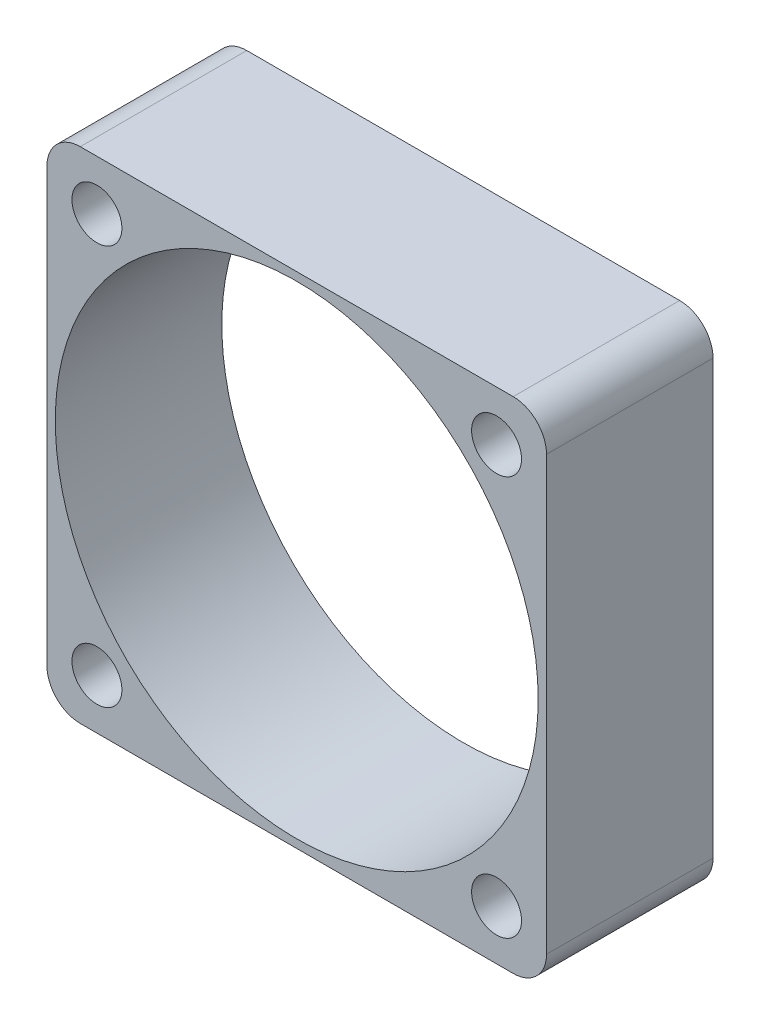
ISO-10303-21;
HEADER;
FILE_DESCRIPTION(('STEP AP214'),'2;1');
FILE_NAME('part.step','',(''),(''),'','','');
FILE_SCHEMA(('AUTOMOTIVE_DESIGN { 1 0 10303 214 1 1 1 1 }'));
ENDSEC;
DATA;
#1=APPLICATION_CONTEXT('core data for automotive mechanical design processes');
#2=APPLICATION_PROTOCOL_DEFINITION('international standard','automotive_design',2000,#1);
#3=PRODUCT_CONTEXT('',#1,'mechanical');
#4=PRODUCT('Part','Part','',(#3));
#5=PRODUCT_RELATED_PRODUCT_CATEGORY('part','',(#4));
#6=PRODUCT_DEFINITION_FORMATION('','',#4);
#7=PRODUCT_DEFINITION_CONTEXT('part definition',#1,'design');
#8=PRODUCT_DEFINITION('design','',#6,#7);
#9=PRODUCT_DEFINITION_SHAPE('','',#8);
#10=(LENGTH_UNIT() NAMED_UNIT(*) SI_UNIT(.MILLI.,.METRE.));
#11=(NAMED_UNIT(*) PLANE_ANGLE_UNIT() SI_UNIT($,.RADIAN.));
#12=(NAMED_UNIT(*) SI_UNIT($,.STERADIAN.) SOLID_ANGLE_UNIT());
#13=UNCERTAINTY_MEASURE_WITH_UNIT(LENGTH_MEASURE(1.E-05),#10,'distance_accuracy_value','');
#14=(GEOMETRIC_REPRESENTATION_CONTEXT(3) GLOBAL_UNCERTAINTY_ASSIGNED_CONTEXT((#13)) GLOBAL_UNIT_ASSIGNED_CONTEXT((#10,
#11,#12)) REPRESENTATION_CONTEXT('',''));
#15=CARTESIAN_POINT('',(0.,0.,0.));
#16=DIRECTION('',(0.,0.,1.));
#17=DIRECTION('',(1.,0.,0.));
#18=AXIS2_PLACEMENT_3D('',#15,#16,#17);
#19=CARTESIAN_POINT('',(0.,0.,10.));
#20=DIRECTION('',(0.,0.,1.));
#21=DIRECTION('',(1.,0.,0.));
#22=AXIS2_PLACEMENT_3D('',#19,#20,#21);
#23=PLANE('',#22);
#24=CARTESIAN_POINT('',(12.,12.,10.));
#25=DIRECTION('',(0.,0.,1.));
#26=DIRECTION('',(-1.,0.,0.));
#27=AXIS2_PLACEMENT_3D('',#24,#25,#26);
#28=CIRCLE('',#27,1.5);
#29=CARTESIAN_POINT('',(10.5,12.,10.));
#30=VERTEX_POINT('',#29);
#31=EDGE_CURVE('E201',#30,#30,#28,.T.);
#32=ORIENTED_EDGE('',*,*,#31,.F.);
#33=EDGE_LOOP('',(#32));
#34=FACE_BOUND('',#33,.T.);
#35=CARTESIAN_POINT('',(12.,-12.,10.));
#36=DIRECTION('',(0.,0.,1.));
#37=DIRECTION('',(1.,0.,0.));
#38=AXIS2_PLACEMENT_3D('',#35,#36,#37);
#39=CIRCLE('',#38,1.5);
#40=CARTESIAN_POINT('',(13.5,-12.,10.));
#41=VERTEX_POINT('',#40);
#42=EDGE_CURVE('E195',#41,#41,#39,.T.);
#43=ORIENTED_EDGE('',*,*,#42,.F.);
#44=EDGE_LOOP('',(#43));
#45=FACE_BOUND('',#44,.T.);
#46=CARTESIAN_POINT('',(-12.,-12.,10.));
#47=DIRECTION('',(0.,0.,1.));
#48=DIRECTION('',(-1.,0.,0.));
#49=AXIS2_PLACEMENT_3D('',#46,#47,#48);
#50=CIRCLE('',#49,1.5);
#51=CARTESIAN_POINT('',(-13.5,-12.,10.));
#52=VERTEX_POINT('',#51);
#53=EDGE_CURVE('E189',#52,#52,#50,.T.);
#54=ORIENTED_EDGE('',*,*,#53,.F.);
#55=EDGE_LOOP('',(#54));
#56=FACE_BOUND('',#55,.T.);
#57=CARTESIAN_POINT('',(-12.,12.,10.));
#58=DIRECTION('',(0.,0.,1.));
#59=DIRECTION('',(1.,0.,0.));
#60=AXIS2_PLACEMENT_3D('',#57,#58,#59);
#61=CIRCLE('',#60,1.5);
#62=CARTESIAN_POINT('',(-10.5,12.,10.));
#63=VERTEX_POINT('',#62);
#64=EDGE_CURVE('E183',#63,#63,#61,.T.);
#65=ORIENTED_EDGE('',*,*,#64,.F.);
#66=EDGE_LOOP('',(#65));
#67=FACE_BOUND('',#66,.T.);
#68=DIRECTION('',(0.,-1.,0.));
#69=VECTOR('',#68,1.);
#70=CARTESIAN_POINT('',(-15.,15.,10.));
#71=LINE('',#70,#69);
#72=CARTESIAN_POINT('',(-15.,13.,10.));
#73=VERTEX_POINT('',#72);
#74=CARTESIAN_POINT('',(-15.,-13.,10.));
#75=VERTEX_POINT('',#74);
#76=EDGE_CURVE('E137',#73,#75,#71,.T.);
#77=ORIENTED_EDGE('',*,*,#76,.T.);
#78=CARTESIAN_POINT('',(-13.,-13.,10.));
#79=DIRECTION('',(0.,0.,1.));
#80=DIRECTION('',(1.,0.,0.));
#81=AXIS2_PLACEMENT_3D('',#78,#79,#80);
#82=CIRCLE('',#81,2.);
#83=CARTESIAN_POINT('',(-13.,-15.,10.));
#84=VERTEX_POINT('',#83);
#85=EDGE_CURVE('E152',#75,#84,#82,.T.);
#86=ORIENTED_EDGE('',*,*,#85,.T.);
#87=DIRECTION('',(1.,0.,0.));
#88=VECTOR('',#87,1.);
#89=CARTESIAN_POINT('',(-15.,-15.,10.));
#90=LINE('',#89,#88);
#91=CARTESIAN_POINT('',(13.,-15.,10.));
#92=VERTEX_POINT('',#91);
#93=EDGE_CURVE('E119',#84,#92,#90,.T.);
#94=ORIENTED_EDGE('',*,*,#93,.T.);
#95=CARTESIAN_POINT('',(13.,-13.,10.));
#96=DIRECTION('',(0.,0.,1.));
#97=DIRECTION('',(1.,0.,0.));
#98=AXIS2_PLACEMENT_3D('',#95,#96,#97);
#99=CIRCLE('',#98,2.);
#100=CARTESIAN_POINT('',(15.,-13.,10.));
#101=VERTEX_POINT('',#100);
#102=EDGE_CURVE('E150',#92,#101,#99,.T.);
#103=ORIENTED_EDGE('',*,*,#102,.T.);
#104=DIRECTION('',(0.,1.,0.));
#105=VECTOR('',#104,1.);
#106=CARTESIAN_POINT('',(15.,15.,10.));
#107=LINE('',#106,#105);
#108=CARTESIAN_POINT('',(15.,13.,10.));
#109=VERTEX_POINT('',#108);
#110=EDGE_CURVE('E163',#101,#109,#107,.T.);
#111=ORIENTED_EDGE('',*,*,#110,.T.);
#112=CARTESIAN_POINT('',(13.,13.,10.));
#113=DIRECTION('',(0.,0.,1.));
#114=DIRECTION('',(1.,0.,0.));
#115=AXIS2_PLACEMENT_3D('',#112,#113,#114);
#116=CIRCLE('',#115,2.);
#117=CARTESIAN_POINT('',(13.,15.,10.));
#118=VERTEX_POINT('',#117);
#119=EDGE_CURVE('E54',#109,#118,#116,.T.);
#120=ORIENTED_EDGE('',*,*,#119,.T.);
#121=DIRECTION('',(-1.,0.,0.));
#122=VECTOR('',#121,1.);
#123=CARTESIAN_POINT('',(-15.,15.,10.));
#124=LINE('',#123,#122);
#125=CARTESIAN_POINT('',(-13.,15.,10.));
#126=VERTEX_POINT('',#125);
#127=EDGE_CURVE('E138',#118,#126,#124,.T.);
#128=ORIENTED_EDGE('',*,*,#127,.T.);
#129=CARTESIAN_POINT('',(-13.,13.,10.));
#130=DIRECTION('',(0.,0.,1.));
#131=DIRECTION('',(1.,0.,0.));
#132=AXIS2_PLACEMENT_3D('',#129,#130,#131);
#133=CIRCLE('',#132,2.);
#134=EDGE_CURVE('E147',#126,#73,#133,.T.);
#135=ORIENTED_EDGE('',*,*,#134,.T.);
#136=EDGE_LOOP('',(#77,#86,#94,#103,#111,#120,#128,#135));
#137=FACE_BOUND('',#136,.T.);
#138=CARTESIAN_POINT('',(0.,0.,10.));
#139=DIRECTION('',(0.,0.,1.));
#140=DIRECTION('',(1.,0.,0.));
#141=AXIS2_PLACEMENT_3D('',#138,#139,#140);
#142=CIRCLE('',#141,14.5);
#143=CARTESIAN_POINT('',(14.5,0.,10.));
#144=VERTEX_POINT('',#143);
#145=EDGE_CURVE('E132',#144,#144,#142,.T.);
#146=ORIENTED_EDGE('',*,*,#145,.F.);
#147=EDGE_LOOP('',(#146));
#148=FACE_BOUND('',#147,.T.);
#149=ADVANCED_FACE('F33',(#34,#45,#56,#67,#137,#148),#23,.T.);
#150=CARTESIAN_POINT('',(0.,0.,0.));
#151=DIRECTION('',(0.,0.,1.));
#152=DIRECTION('',(1.,0.,0.));
#153=AXIS2_PLACEMENT_3D('',#150,#151,#152);
#154=PLANE('',#153);
#155=CARTESIAN_POINT('',(12.,12.,0.));
#156=DIRECTION('',(0.,0.,1.));
#157=DIRECTION('',(-1.,0.,0.));
#158=AXIS2_PLACEMENT_3D('',#155,#156,#157);
#159=CIRCLE('',#158,1.5);
#160=CARTESIAN_POINT('',(10.5,12.,0.));
#161=VERTEX_POINT('',#160);
#162=EDGE_CURVE('E186',#161,#161,#159,.T.);
#163=ORIENTED_EDGE('',*,*,#162,.T.);
#164=EDGE_LOOP('',(#163));
#165=FACE_BOUND('',#164,.T.);
#166=CARTESIAN_POINT('',(12.,-12.,0.));
#167=DIRECTION('',(0.,0.,1.));
#168=DIRECTION('',(1.,0.,0.));
#169=AXIS2_PLACEMENT_3D('',#166,#167,#168);
#170=CIRCLE('',#169,1.5);
#171=CARTESIAN_POINT('',(13.5,-12.,0.));
#172=VERTEX_POINT('',#171);
#173=EDGE_CURVE('E198',#172,#172,#170,.T.);
#174=ORIENTED_EDGE('',*,*,#173,.T.);
#175=EDGE_LOOP('',(#174));
#176=FACE_BOUND('',#175,.T.);
#177=CARTESIAN_POINT('',(-12.,-12.,0.));
#178=DIRECTION('',(0.,0.,1.));
#179=DIRECTION('',(-1.,0.,0.));
#180=AXIS2_PLACEMENT_3D('',#177,#178,#179);
#181=CIRCLE('',#180,1.5);
#182=CARTESIAN_POINT('',(-13.5,-12.,0.));
#183=VERTEX_POINT('',#182);
#184=EDGE_CURVE('E192',#183,#183,#181,.T.);
#185=ORIENTED_EDGE('',*,*,#184,.T.);
#186=EDGE_LOOP('',(#185));
#187=FACE_BOUND('',#186,.T.);
#188=CARTESIAN_POINT('',(-12.,12.,0.));
#189=DIRECTION('',(0.,0.,1.));
#190=DIRECTION('',(1.,0.,0.));
#191=AXIS2_PLACEMENT_3D('',#188,#189,#190);
#192=CIRCLE('',#191,1.5);
#193=CARTESIAN_POINT('',(-10.5,12.,0.));
#194=VERTEX_POINT('',#193);
#195=EDGE_CURVE('E180',#194,#194,#192,.T.);
#196=ORIENTED_EDGE('',*,*,#195,.T.);
#197=EDGE_LOOP('',(#196));
#198=FACE_BOUND('',#197,.T.);
#199=DIRECTION('',(1.,0.,0.));
#200=VECTOR('',#199,1.);
#201=CARTESIAN_POINT('',(-15.,-15.,0.));
#202=LINE('',#201,#200);
#203=CARTESIAN_POINT('',(-13.,-15.,0.));
#204=VERTEX_POINT('',#203);
#205=CARTESIAN_POINT('',(13.,-15.,0.));
#206=VERTEX_POINT('',#205);
#207=EDGE_CURVE('E116',#204,#206,#202,.T.);
#208=ORIENTED_EDGE('',*,*,#207,.F.);
#209=CARTESIAN_POINT('',(-13.,-13.,0.));
#210=DIRECTION('',(0.,0.,1.));
#211=DIRECTION('',(1.,0.,0.));
#212=AXIS2_PLACEMENT_3D('',#209,#210,#211);
#213=CIRCLE('',#212,2.);
#214=CARTESIAN_POINT('',(-15.,-13.,0.));
#215=VERTEX_POINT('',#214);
#216=EDGE_CURVE('E99',#204,#215,#213,.F.);
#217=ORIENTED_EDGE('',*,*,#216,.T.);
#218=DIRECTION('',(0.,-1.,0.));
#219=VECTOR('',#218,1.);
#220=CARTESIAN_POINT('',(-15.,15.,0.));
#221=LINE('',#220,#219);
#222=CARTESIAN_POINT('',(-15.,13.,0.));
#223=VERTEX_POINT('',#222);
#224=EDGE_CURVE('E127',#223,#215,#221,.T.);
#225=ORIENTED_EDGE('',*,*,#224,.F.);
#226=CARTESIAN_POINT('',(-13.,13.,0.));
#227=DIRECTION('',(0.,0.,1.));
#228=DIRECTION('',(1.,0.,0.));
#229=AXIS2_PLACEMENT_3D('',#226,#227,#228);
#230=CIRCLE('',#229,2.);
#231=CARTESIAN_POINT('',(-13.,15.,0.));
#232=VERTEX_POINT('',#231);
#233=EDGE_CURVE('E120',#223,#232,#230,.F.);
#234=ORIENTED_EDGE('',*,*,#233,.T.);
#235=DIRECTION('',(-1.,0.,0.));
#236=VECTOR('',#235,1.);
#237=CARTESIAN_POINT('',(-15.,15.,0.));
#238=LINE('',#237,#236);
#239=CARTESIAN_POINT('',(13.,15.,0.));
#240=VERTEX_POINT('',#239);
#241=EDGE_CURVE('E130',#240,#232,#238,.T.);
#242=ORIENTED_EDGE('',*,*,#241,.F.);
#243=CARTESIAN_POINT('',(13.,13.,0.));
#244=DIRECTION('',(0.,0.,1.));
#245=DIRECTION('',(1.,0.,0.));
#246=AXIS2_PLACEMENT_3D('',#243,#244,#245);
#247=CIRCLE('',#246,2.);
#248=CARTESIAN_POINT('',(15.,13.,0.));
#249=VERTEX_POINT('',#248);
#250=EDGE_CURVE('E141',#240,#249,#247,.F.);
#251=ORIENTED_EDGE('',*,*,#250,.T.);
#252=DIRECTION('',(0.,1.,0.));
#253=VECTOR('',#252,1.);
#254=CARTESIAN_POINT('',(15.,15.,0.));
#255=LINE('',#254,#253);
#256=CARTESIAN_POINT('',(15.,-13.,0.));
#257=VERTEX_POINT('',#256);
#258=EDGE_CURVE('E126',#257,#249,#255,.T.);
#259=ORIENTED_EDGE('',*,*,#258,.F.);
#260=CARTESIAN_POINT('',(13.,-13.,0.));
#261=DIRECTION('',(0.,0.,1.));
#262=DIRECTION('',(1.,0.,0.));
#263=AXIS2_PLACEMENT_3D('',#260,#261,#262);
#264=CIRCLE('',#263,2.);
#265=EDGE_CURVE('E110',#257,#206,#264,.F.);
#266=ORIENTED_EDGE('',*,*,#265,.T.);
#267=EDGE_LOOP('',(#208,#217,#225,#234,#242,#251,#259,#266));
#268=FACE_BOUND('',#267,.T.);
#269=CARTESIAN_POINT('',(0.,0.,0.));
#270=DIRECTION('',(0.,0.,1.));
#271=DIRECTION('',(1.,0.,0.));
#272=AXIS2_PLACEMENT_3D('',#269,#270,#271);
#273=CIRCLE('',#272,14.5);
#274=CARTESIAN_POINT('',(14.5,0.,0.));
#275=VERTEX_POINT('',#274);
#276=EDGE_CURVE('E177',#275,#275,#273,.T.);
#277=ORIENTED_EDGE('',*,*,#276,.T.);
#278=EDGE_LOOP('',(#277));
#279=FACE_BOUND('',#278,.T.);
#280=ADVANCED_FACE('F123',(#165,#176,#187,#198,#268,#279),#154,.F.);
#281=CARTESIAN_POINT('',(-15.,15.,10.));
#282=DIRECTION('',(1.,0.,0.));
#283=DIRECTION('',(0.,1.,0.));
#284=AXIS2_PLACEMENT_3D('',#281,#282,#283);
#285=PLANE('',#284);
#286=ORIENTED_EDGE('',*,*,#224,.T.);
#287=DIRECTION('',(0.,0.,-1.));
#288=VECTOR('',#287,1.);
#289=CARTESIAN_POINT('',(-15.,-13.,10.));
#290=LINE('',#289,#288);
#291=EDGE_CURVE('E104',#215,#75,#290,.F.);
#292=ORIENTED_EDGE('',*,*,#291,.T.);
#293=ORIENTED_EDGE('',*,*,#76,.F.);
#294=DIRECTION('',(0.,0.,-1.));
#295=VECTOR('',#294,1.);
#296=CARTESIAN_POINT('',(-15.,13.,10.));
#297=LINE('',#296,#295);
#298=EDGE_CURVE('E109',#73,#223,#297,.T.);
#299=ORIENTED_EDGE('',*,*,#298,.T.);
#300=EDGE_LOOP('',(#286,#292,#293,#299));
#301=FACE_BOUND('',#300,.T.);
#302=ADVANCED_FACE('F234',(#301),#285,.F.);
#303=CARTESIAN_POINT('',(-15.,-15.,10.));
#304=DIRECTION('',(0.,1.,0.));
#305=DIRECTION('',(-1.,0.,0.));
#306=AXIS2_PLACEMENT_3D('',#303,#304,#305);
#307=PLANE('',#306);
#308=ORIENTED_EDGE('',*,*,#93,.F.);
#309=DIRECTION('',(0.,0.,-1.));
#310=VECTOR('',#309,1.);
#311=CARTESIAN_POINT('',(-13.,-15.,10.));
#312=LINE('',#311,#310);
#313=EDGE_CURVE('E103',#84,#204,#312,.T.);
#314=ORIENTED_EDGE('',*,*,#313,.T.);
#315=ORIENTED_EDGE('',*,*,#207,.T.);
#316=DIRECTION('',(0.,0.,-1.));
#317=VECTOR('',#316,1.);
#318=CARTESIAN_POINT('',(13.,-15.,10.));
#319=LINE('',#318,#317);
#320=EDGE_CURVE('E121',#206,#92,#319,.F.);
#321=ORIENTED_EDGE('',*,*,#320,.T.);
#322=EDGE_LOOP('',(#308,#314,#315,#321));
#323=FACE_BOUND('',#322,.T.);
#324=ADVANCED_FACE('F115',(#323),#307,.F.);
#325=CARTESIAN_POINT('',(15.,15.,10.));
#326=DIRECTION('',(-1.,0.,0.));
#327=DIRECTION('',(0.,0.,1.));
#328=AXIS2_PLACEMENT_3D('',#325,#326,#327);
#329=PLANE('',#328);
#330=ORIENTED_EDGE('',*,*,#110,.F.);
#331=DIRECTION('',(0.,0.,-1.));
#332=VECTOR('',#331,1.);
#333=CARTESIAN_POINT('',(15.,-13.,10.));
#334=LINE('',#333,#332);
#335=EDGE_CURVE('E156',#101,#257,#334,.T.);
#336=ORIENTED_EDGE('',*,*,#335,.T.);
#337=ORIENTED_EDGE('',*,*,#258,.T.);
#338=DIRECTION('',(0.,0.,-1.));
#339=VECTOR('',#338,1.);
#340=CARTESIAN_POINT('',(15.,13.,10.));
#341=LINE('',#340,#339);
#342=EDGE_CURVE('E154',#249,#109,#341,.F.);
#343=ORIENTED_EDGE('',*,*,#342,.T.);
#344=EDGE_LOOP('',(#330,#336,#337,#343));
#345=FACE_BOUND('',#344,.T.);
#346=ADVANCED_FACE('F161',(#345),#329,.F.);
#347=CARTESIAN_POINT('',(-15.,15.,10.));
#348=DIRECTION('',(0.,-1.,0.));
#349=DIRECTION('',(0.,0.,-1.));
#350=AXIS2_PLACEMENT_3D('',#347,#348,#349);
#351=PLANE('',#350);
#352=ORIENTED_EDGE('',*,*,#127,.F.);
#353=DIRECTION('',(0.,0.,-1.));
#354=VECTOR('',#353,1.);
#355=CARTESIAN_POINT('',(13.,15.,10.));
#356=LINE('',#355,#354);
#357=EDGE_CURVE('E11',#118,#240,#356,.T.);
#358=ORIENTED_EDGE('',*,*,#357,.T.);
#359=ORIENTED_EDGE('',*,*,#241,.T.);
#360=DIRECTION('',(0.,0.,-1.));
#361=VECTOR('',#360,1.);
#362=CARTESIAN_POINT('',(-13.,15.,10.));
#363=LINE('',#362,#361);
#364=EDGE_CURVE('E41',#232,#126,#363,.F.);
#365=ORIENTED_EDGE('',*,*,#364,.T.);
#366=EDGE_LOOP('',(#352,#358,#359,#365));
#367=FACE_BOUND('',#366,.T.);
#368=ADVANCED_FACE('F170',(#367),#351,.F.);
#369=CARTESIAN_POINT('',(0.,0.,10.));
#370=DIRECTION('',(0.,0.,-1.));
#371=DIRECTION('',(-1.,0.,0.));
#372=AXIS2_PLACEMENT_3D('',#369,#370,#371);
#373=CYLINDRICAL_SURFACE('',#372,14.5);
#374=ORIENTED_EDGE('',*,*,#145,.T.);
#375=EDGE_LOOP('',(#374));
#376=FACE_BOUND('',#375,.T.);
#377=ORIENTED_EDGE('',*,*,#276,.F.);
#378=EDGE_LOOP('',(#377));
#379=FACE_BOUND('',#378,.T.);
#380=ADVANCED_FACE('F228',(#376,#379),#373,.F.);
#381=CARTESIAN_POINT('',(-13.,-13.,10.));
#382=DIRECTION('',(0.,0.,-1.));
#383=DIRECTION('',(-1.,0.,0.));
#384=AXIS2_PLACEMENT_3D('',#381,#382,#383);
#385=CYLINDRICAL_SURFACE('',#384,2.);
#386=ORIENTED_EDGE('',*,*,#85,.F.);
#387=ORIENTED_EDGE('',*,*,#291,.F.);
#388=ORIENTED_EDGE('',*,*,#216,.F.);
#389=ORIENTED_EDGE('',*,*,#313,.F.);
#390=EDGE_LOOP('',(#386,#387,#388,#389));
#391=FACE_BOUND('',#390,.T.);
#392=ADVANCED_FACE('F102',(#391),#385,.T.);
#393=CARTESIAN_POINT('',(13.,-13.,10.));
#394=DIRECTION('',(0.,0.,-1.));
#395=DIRECTION('',(-1.,0.,0.));
#396=AXIS2_PLACEMENT_3D('',#393,#394,#395);
#397=CYLINDRICAL_SURFACE('',#396,2.);
#398=ORIENTED_EDGE('',*,*,#102,.F.);
#399=ORIENTED_EDGE('',*,*,#320,.F.);
#400=ORIENTED_EDGE('',*,*,#265,.F.);
#401=ORIENTED_EDGE('',*,*,#335,.F.);
#402=EDGE_LOOP('',(#398,#399,#400,#401));
#403=FACE_BOUND('',#402,.T.);
#404=ADVANCED_FACE('F251',(#403),#397,.T.);
#405=CARTESIAN_POINT('',(13.,13.,10.));
#406=DIRECTION('',(0.,0.,-1.));
#407=DIRECTION('',(-1.,0.,0.));
#408=AXIS2_PLACEMENT_3D('',#405,#406,#407);
#409=CYLINDRICAL_SURFACE('',#408,2.);
#410=ORIENTED_EDGE('',*,*,#119,.F.);
#411=ORIENTED_EDGE('',*,*,#342,.F.);
#412=ORIENTED_EDGE('',*,*,#250,.F.);
#413=ORIENTED_EDGE('',*,*,#357,.F.);
#414=EDGE_LOOP('',(#410,#411,#412,#413));
#415=FACE_BOUND('',#414,.T.);
#416=ADVANCED_FACE('F169',(#415),#409,.T.);
#417=CARTESIAN_POINT('',(-13.,13.,10.));
#418=DIRECTION('',(0.,0.,-1.));
#419=DIRECTION('',(-1.,0.,0.));
#420=AXIS2_PLACEMENT_3D('',#417,#418,#419);
#421=CYLINDRICAL_SURFACE('',#420,2.);
#422=ORIENTED_EDGE('',*,*,#134,.F.);
#423=ORIENTED_EDGE('',*,*,#364,.F.);
#424=ORIENTED_EDGE('',*,*,#233,.F.);
#425=ORIENTED_EDGE('',*,*,#298,.F.);
#426=EDGE_LOOP('',(#422,#423,#424,#425));
#427=FACE_BOUND('',#426,.T.);
#428=ADVANCED_FACE('F35',(#427),#421,.T.);
#429=CARTESIAN_POINT('',(-12.,12.,0.));
#430=DIRECTION('',(0.,0.,1.));
#431=DIRECTION('',(1.,0.,0.));
#432=AXIS2_PLACEMENT_3D('',#429,#430,#431);
#433=CYLINDRICAL_SURFACE('',#432,1.5);
#434=ORIENTED_EDGE('',*,*,#195,.F.);
#435=EDGE_LOOP('',(#434));
#436=FACE_BOUND('',#435,.T.);
#437=ORIENTED_EDGE('',*,*,#64,.T.);
#438=EDGE_LOOP('',(#437));
#439=FACE_BOUND('',#438,.T.);
#440=ADVANCED_FACE('F257',(#436,#439),#433,.F.);
#441=CARTESIAN_POINT('',(-12.,-12.,0.));
#442=DIRECTION('',(0.,0.,1.));
#443=DIRECTION('',(1.,0.,0.));
#444=AXIS2_PLACEMENT_3D('',#441,#442,#443);
#445=CYLINDRICAL_SURFACE('',#444,1.5);
#446=ORIENTED_EDGE('',*,*,#184,.F.);
#447=EDGE_LOOP('',(#446));
#448=FACE_BOUND('',#447,.T.);
#449=ORIENTED_EDGE('',*,*,#53,.T.);
#450=EDGE_LOOP('',(#449));
#451=FACE_BOUND('',#450,.T.);
#452=ADVANCED_FACE('F262',(#448,#451),#445,.F.);
#453=CARTESIAN_POINT('',(12.,-12.,0.));
#454=DIRECTION('',(0.,0.,1.));
#455=DIRECTION('',(1.,0.,0.));
#456=AXIS2_PLACEMENT_3D('',#453,#454,#455);
#457=CYLINDRICAL_SURFACE('',#456,1.5);
#458=ORIENTED_EDGE('',*,*,#173,.F.);
#459=EDGE_LOOP('',(#458));
#460=FACE_BOUND('',#459,.T.);
#461=ORIENTED_EDGE('',*,*,#42,.T.);
#462=EDGE_LOOP('',(#461));
#463=FACE_BOUND('',#462,.T.);
#464=ADVANCED_FACE('F212',(#460,#463),#457,.F.);
#465=CARTESIAN_POINT('',(12.,12.,0.));
#466=DIRECTION('',(0.,0.,1.));
#467=DIRECTION('',(1.,0.,0.));
#468=AXIS2_PLACEMENT_3D('',#465,#466,#467);
#469=CYLINDRICAL_SURFACE('',#468,1.5);
#470=ORIENTED_EDGE('',*,*,#162,.F.);
#471=EDGE_LOOP('',(#470));
#472=FACE_BOUND('',#471,.T.);
#473=ORIENTED_EDGE('',*,*,#31,.T.);
#474=EDGE_LOOP('',(#473));
#475=FACE_BOUND('',#474,.T.);
#476=ADVANCED_FACE('F209',(#472,#475),#469,.F.);
#477=CLOSED_SHELL('',(#149,#280,#302,#324,#346,#368,#380,#392,#404,#416,#428,#440,#452,#464,#476));
#478=MANIFOLD_SOLID_BREP('B2',#477);
#479=ADVANCED_BREP_SHAPE_REPRESENTATION('',(#18,#478),#14);
#480=SHAPE_DEFINITION_REPRESENTATION(#9,#479);
ENDSEC;
END-ISO-10303-21;
